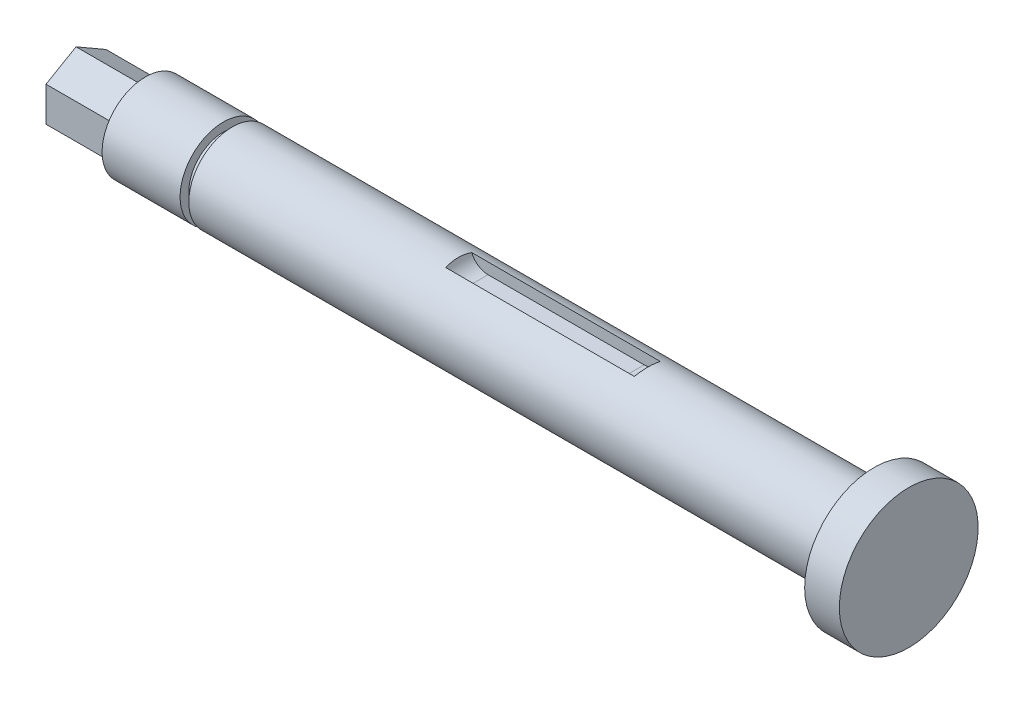
ISO-10303-21;
HEADER;
FILE_DESCRIPTION(('STEP AP214'),'2;1');
FILE_NAME('part.step','',(''),(''),'','','');
FILE_SCHEMA(('AUTOMOTIVE_DESIGN { 1 0 10303 214 1 1 1 1 }'));
ENDSEC;
DATA;
#1=APPLICATION_CONTEXT('core data for automotive mechanical design processes');
#2=APPLICATION_PROTOCOL_DEFINITION('international standard','automotive_design',2000,#1);
#3=PRODUCT_CONTEXT('',#1,'mechanical');
#4=PRODUCT('Part','Part','',(#3));
#5=PRODUCT_RELATED_PRODUCT_CATEGORY('part','',(#4));
#6=PRODUCT_DEFINITION_FORMATION('','',#4);
#7=PRODUCT_DEFINITION_CONTEXT('part definition',#1,'design');
#8=PRODUCT_DEFINITION('design','',#6,#7);
#9=PRODUCT_DEFINITION_SHAPE('','',#8);
#10=(LENGTH_UNIT() NAMED_UNIT(*) SI_UNIT(.MILLI.,.METRE.));
#11=(NAMED_UNIT(*) PLANE_ANGLE_UNIT() SI_UNIT($,.RADIAN.));
#12=(NAMED_UNIT(*) SI_UNIT($,.STERADIAN.) SOLID_ANGLE_UNIT());
#13=UNCERTAINTY_MEASURE_WITH_UNIT(LENGTH_MEASURE(1.E-05),#10,'distance_accuracy_value','');
#14=(GEOMETRIC_REPRESENTATION_CONTEXT(3) GLOBAL_UNCERTAINTY_ASSIGNED_CONTEXT((#13)) GLOBAL_UNIT_ASSIGNED_CONTEXT((#10,
#11,#12)) REPRESENTATION_CONTEXT('',''));
#15=CARTESIAN_POINT('',(0.,0.,0.));
#16=DIRECTION('',(0.,0.,1.));
#17=DIRECTION('',(1.,0.,0.));
#18=AXIS2_PLACEMENT_3D('',#15,#16,#17);
#19=CARTESIAN_POINT('',(12.7,6.35,0.));
#20=DIRECTION('',(1.,0.,0.));
#21=DIRECTION('',(0.,0.,-1.));
#22=AXIS2_PLACEMENT_3D('',#19,#20,#21);
#23=PLANE('',#22);
#24=DIRECTION('',(0.,-1.,0.));
#25=VECTOR('',#24,1.);
#26=CARTESIAN_POINT('',(12.7,3.17499999999999,-5.49926131403119));
#27=LINE('',#26,#25);
#28=CARTESIAN_POINT('',(12.7,3.17499999999998,-5.4992613140312));
#29=VERTEX_POINT('',#28);
#30=CARTESIAN_POINT('',(12.7,-3.17500000000002,-5.49926131403117));
#31=VERTEX_POINT('',#30);
#32=EDGE_CURVE('E166',#29,#31,#27,.T.);
#33=ORIENTED_EDGE('',*,*,#32,.F.);
#34=DIRECTION('',(0.,-0.499999999999996,-0.866025403784441));
#35=VECTOR('',#34,1.);
#36=CARTESIAN_POINT('',(12.7,6.34999999999993,0.));
#37=LINE('',#36,#35);
#38=CARTESIAN_POINT('',(12.7,6.34999999999993,0.));
#39=VERTEX_POINT('',#38);
#40=EDGE_CURVE('E97',#39,#29,#37,.T.);
#41=ORIENTED_EDGE('',*,*,#40,.F.);
#42=DIRECTION('',(0.,0.499999999999995,-0.866025403784442));
#43=VECTOR('',#42,1.);
#44=CARTESIAN_POINT('',(12.7,3.175,5.49926131403111));
#45=LINE('',#44,#43);
#46=CARTESIAN_POINT('',(12.7,3.175,5.49926131403111));
#47=VERTEX_POINT('',#46);
#48=EDGE_CURVE('E163',#47,#39,#45,.T.);
#49=ORIENTED_EDGE('',*,*,#48,.F.);
#50=DIRECTION('',(0.,1.,0.));
#51=VECTOR('',#50,1.);
#52=CARTESIAN_POINT('',(12.7,-3.17499999999995,5.49926131403121));
#53=LINE('',#52,#51);
#54=CARTESIAN_POINT('',(12.7,-3.17499999999995,5.49926131403121));
#55=VERTEX_POINT('',#54);
#56=EDGE_CURVE('E173',#55,#47,#53,.T.);
#57=ORIENTED_EDGE('',*,*,#56,.F.);
#58=DIRECTION('',(0.,0.500000000000007,0.866025403784435));
#59=VECTOR('',#58,1.);
#60=CARTESIAN_POINT('',(12.7,-6.35,0.));
#61=LINE('',#60,#59);
#62=CARTESIAN_POINT('',(12.7,-6.35,0.));
#63=VERTEX_POINT('',#62);
#64=EDGE_CURVE('E182',#63,#55,#61,.T.);
#65=ORIENTED_EDGE('',*,*,#64,.F.);
#66=DIRECTION('',(0.,-0.499999999999995,0.866025403784442));
#67=VECTOR('',#66,1.);
#68=CARTESIAN_POINT('',(12.7,-3.17500000000002,-5.49926131403117));
#69=LINE('',#68,#67);
#70=EDGE_CURVE('E187',#31,#63,#69,.T.);
#71=ORIENTED_EDGE('',*,*,#70,.F.);
#72=EDGE_LOOP('',(#33,#41,#49,#57,#65,#71));
#73=FACE_BOUND('',#72,.T.);
#74=CARTESIAN_POINT('',(12.7,0.,0.));
#75=DIRECTION('',(-1.,0.,0.));
#76=DIRECTION('',(0.,0.,1.));
#77=AXIS2_PLACEMENT_3D('',#74,#75,#76);
#78=CIRCLE('',#77,7.9375);
#79=CARTESIAN_POINT('',(12.7,0.,7.9375));
#80=VERTEX_POINT('',#79);
#81=EDGE_CURVE('E266',#80,#80,#78,.T.);
#82=ORIENTED_EDGE('',*,*,#81,.T.);
#83=EDGE_LOOP('',(#82));
#84=FACE_BOUND('',#83,.T.);
#85=ADVANCED_FACE('F74',(#73,#84),#23,.F.);
#86=CARTESIAN_POINT('',(-160.725070542685,0.,0.));
#87=DIRECTION('',(-1.,0.,0.));
#88=DIRECTION('',(0.,0.,1.));
#89=AXIS2_PLACEMENT_3D('',#86,#87,#88);
#90=CYLINDRICAL_SURFACE('',#89,7.9375);
#91=ORIENTED_EDGE('',*,*,#81,.F.);
#92=EDGE_LOOP('',(#91));
#93=FACE_BOUND('',#92,.T.);
#94=CARTESIAN_POINT('',(26.9748,0.,0.));
#95=DIRECTION('',(-1.,0.,0.));
#96=DIRECTION('',(0.,0.,1.));
#97=AXIS2_PLACEMENT_3D('',#94,#95,#96);
#98=CIRCLE('',#97,7.9375);
#99=CARTESIAN_POINT('',(26.9748,0.,7.9375));
#100=VERTEX_POINT('',#99);
#101=EDGE_CURVE('E262',#100,#100,#98,.T.);
#102=ORIENTED_EDGE('',*,*,#101,.T.);
#103=EDGE_LOOP('',(#102));
#104=FACE_BOUND('',#103,.T.);
#105=ADVANCED_FACE('F319',(#93,#104),#90,.T.);
#106=CARTESIAN_POINT('',(26.9748,7.9375,0.));
#107=DIRECTION('',(-1.,0.,0.));
#108=DIRECTION('',(0.,0.,1.));
#109=AXIS2_PLACEMENT_3D('',#106,#107,#108);
#110=PLANE('',#109);
#111=ORIENTED_EDGE('',*,*,#101,.F.);
#112=EDGE_LOOP('',(#111));
#113=FACE_BOUND('',#112,.T.);
#114=CARTESIAN_POINT('',(26.9748,0.,0.));
#115=DIRECTION('',(-1.,0.,0.));
#116=DIRECTION('',(0.,0.,1.));
#117=AXIS2_PLACEMENT_3D('',#114,#115,#116);
#118=CIRCLE('',#117,6.3373);
#119=CARTESIAN_POINT('',(26.9748,0.,6.3373));
#120=VERTEX_POINT('',#119);
#121=EDGE_CURVE('E258',#120,#120,#118,.T.);
#122=ORIENTED_EDGE('',*,*,#121,.T.);
#123=EDGE_LOOP('',(#122));
#124=FACE_BOUND('',#123,.T.);
#125=ADVANCED_FACE('F325',(#113,#124),#110,.F.);
#126=CARTESIAN_POINT('',(-160.725070542685,0.,0.));
#127=DIRECTION('',(-1.,0.,0.));
#128=DIRECTION('',(0.,0.,1.));
#129=AXIS2_PLACEMENT_3D('',#126,#127,#128);
#130=CYLINDRICAL_SURFACE('',#129,6.3373);
#131=ORIENTED_EDGE('',*,*,#121,.F.);
#132=EDGE_LOOP('',(#131));
#133=FACE_BOUND('',#132,.T.);
#134=CARTESIAN_POINT('',(28.575,0.,0.));
#135=DIRECTION('',(-1.,0.,0.));
#136=DIRECTION('',(0.,0.,1.));
#137=AXIS2_PLACEMENT_3D('',#134,#135,#136);
#138=CIRCLE('',#137,6.3373);
#139=CARTESIAN_POINT('',(28.575,0.,6.3373));
#140=VERTEX_POINT('',#139);
#141=EDGE_CURVE('E254',#140,#140,#138,.T.);
#142=ORIENTED_EDGE('',*,*,#141,.T.);
#143=EDGE_LOOP('',(#142));
#144=FACE_BOUND('',#143,.T.);
#145=ADVANCED_FACE('F331',(#133,#144),#130,.T.);
#146=CARTESIAN_POINT('',(28.575,6.3373,0.));
#147=DIRECTION('',(1.,0.,0.));
#148=DIRECTION('',(0.,0.,-1.));
#149=AXIS2_PLACEMENT_3D('',#146,#147,#148);
#150=PLANE('',#149);
#151=ORIENTED_EDGE('',*,*,#141,.F.);
#152=EDGE_LOOP('',(#151));
#153=FACE_BOUND('',#152,.T.);
#154=CARTESIAN_POINT('',(28.575,0.,0.));
#155=DIRECTION('',(-1.,0.,0.));
#156=DIRECTION('',(0.,0.,1.));
#157=AXIS2_PLACEMENT_3D('',#154,#155,#156);
#158=CIRCLE('',#157,7.9375);
#159=CARTESIAN_POINT('',(28.575,0.,7.9375));
#160=VERTEX_POINT('',#159);
#161=EDGE_CURVE('E250',#160,#160,#158,.T.);
#162=ORIENTED_EDGE('',*,*,#161,.T.);
#163=EDGE_LOOP('',(#162));
#164=FACE_BOUND('',#163,.T.);
#165=ADVANCED_FACE('F314',(#153,#164),#150,.F.);
#166=CARTESIAN_POINT('',(-160.725070542685,0.,0.));
#167=DIRECTION('',(-1.,0.,0.));
#168=DIRECTION('',(0.,0.,1.));
#169=AXIS2_PLACEMENT_3D('',#166,#167,#168);
#170=CYLINDRICAL_SURFACE('',#169,7.9375);
#171=CARTESIAN_POINT('',(70.0667575318649,7.57189241124701,2.38125));
#172=CARTESIAN_POINT('',(70.0547077003657,7.60283748159561,2.2828611464457));
#173=CARTESIAN_POINT('',(70.0439278662388,7.63190103640766,2.18373394589652));
#174=CARTESIAN_POINT('',(70.0245768049551,7.68618284099055,1.98423094459988));
#175=CARTESIAN_POINT('',(70.0160053112933,7.71140155461096,1.88385529605055));
#176=CARTESIAN_POINT('',(70.0007406043774,7.75790730479949,1.68210998868868));
#177=CARTESIAN_POINT('',(69.9940464557926,7.77919629741932,1.58074085099975));
#178=CARTESIAN_POINT('',(69.9822696330404,7.81780480710201,1.37716069329768));
#179=CARTESIAN_POINT('',(69.9771870047471,7.83512421116123,1.2749496494035));
#180=CARTESIAN_POINT('',(69.9642408857745,7.88028783199856,0.972518602068048));
#181=CARTESIAN_POINT('',(69.9583162704699,7.90252061667355,0.771346365920788));
#182=CARTESIAN_POINT('',(69.9506794210857,7.93155475211319,0.367812192026652));
#183=CARTESIAN_POINT('',(69.9489677390323,7.93835408060337,0.165450101853557));
#184=CARTESIAN_POINT('',(69.949442775625,7.93650243379859,-0.233209512953227));
#185=CARTESIAN_POINT('',(69.9515157047947,7.92830242011707,-0.42950940820735));
#186=CARTESIAN_POINT('',(69.9596947493576,7.89737846148739,-0.820870390107997));
#187=CARTESIAN_POINT('',(69.9658001587861,7.87465705881517,-1.01593168756148));
#188=CARTESIAN_POINT('',(69.9788488663797,7.82945029286182,-1.30909544958882));
#189=CARTESIAN_POINT('',(69.9839338818715,7.81224594563471,-1.40812396106605));
#190=CARTESIAN_POINT('',(69.9956400417717,7.77410905883621,-1.60537279101093));
#191=CARTESIAN_POINT('',(70.0022611439788,7.7531766216913,-1.70359313160493));
#192=CARTESIAN_POINT('',(70.0172851652548,7.70762154640837,-1.89909267282386));
#193=CARTESIAN_POINT('',(70.0256890236687,7.68299696487047,-1.99637134891407));
#194=CARTESIAN_POINT('',(70.0445825527755,7.63013554179114,-2.18974831448237));
#195=CARTESIAN_POINT('',(70.0550724600671,7.60189829063224,-2.28584646875236));
#196=CARTESIAN_POINT('',(70.0667575318649,7.57189241124701,-2.38125));
#197=B_SPLINE_CURVE_WITH_KNOTS('',3,(#171,#172,#173,#174,#175,#176,#177,#178,#179,#180,#181,
#182,#183,#184,#185,#186,#187,#188,#189,#190,#191,#192,#193,#194,#195,#196),.UNSPECIFIED.,.F.,
.F.,(4,2,2,2,2,2,2,2,2,2,2,2,4),(0.,0.311486004627483,0.622934401155592,0.934227351103223,
1.24552916163332,1.85227877141673,2.45910788014199,3.0479913842207,3.63677182003085,
3.93862384263224,4.24046757335365,4.54247074416797,4.84450818758329),.UNSPECIFIED.);
#198=CARTESIAN_POINT('',(70.0667575318649,7.57189241124701,2.38125));
#199=VERTEX_POINT('',#198);
#200=CARTESIAN_POINT('',(70.0667575318649,7.57189241124701,-2.38125));
#201=VERTEX_POINT('',#200);
#202=EDGE_CURVE('E273',#199,#201,#197,.T.);
#203=ORIENTED_EDGE('',*,*,#202,.T.);
#204=DIRECTION('',(-1.,0.,0.));
#205=VECTOR('',#204,1.);
#206=CARTESIAN_POINT('',(-160.725070542685,7.57189241124701,-2.38125));
#207=LINE('',#206,#205);
#208=CARTESIAN_POINT('',(104.558242468135,7.57189241124701,-2.38125));
#209=VERTEX_POINT('',#208);
#210=EDGE_CURVE('E13',#201,#209,#207,.F.);
#211=ORIENTED_EDGE('',*,*,#210,.T.);
#212=CARTESIAN_POINT('',(104.558242468135,7.57189241124701,-2.38125));
#213=CARTESIAN_POINT('',(104.570292299634,7.60283748159561,-2.28286114644571));
#214=CARTESIAN_POINT('',(104.581072133761,7.63190103640766,-2.18373394589652));
#215=CARTESIAN_POINT('',(104.600423195045,7.68618284099055,-1.98423094459988));
#216=CARTESIAN_POINT('',(104.608994688707,7.71140155461096,-1.88385529605055));
#217=CARTESIAN_POINT('',(104.624259395623,7.75790730479949,-1.68210998868868));
#218=CARTESIAN_POINT('',(104.630953544207,7.77919629741932,-1.58074085099974));
#219=CARTESIAN_POINT('',(104.64273036696,7.81780480710201,-1.37716069329768));
#220=CARTESIAN_POINT('',(104.647812995253,7.83512421116124,-1.2749496494035));
#221=CARTESIAN_POINT('',(104.660759114225,7.88028783199856,-0.972518602068044));
#222=CARTESIAN_POINT('',(104.66668372953,7.90252061667355,-0.771346365920781));
#223=CARTESIAN_POINT('',(104.674320578914,7.93155475211319,-0.367812192026643));
#224=CARTESIAN_POINT('',(104.676032260968,7.93835408060337,-0.165450101853547));
#225=CARTESIAN_POINT('',(104.675557224375,7.93650243379859,0.233209512953237));
#226=CARTESIAN_POINT('',(104.673484295205,7.92830242011707,0.42950940820736));
#227=CARTESIAN_POINT('',(104.665305250642,7.89737846148739,0.820870390108005));
#228=CARTESIAN_POINT('',(104.659199841214,7.87465705881517,1.01593168756148));
#229=CARTESIAN_POINT('',(104.64615113362,7.82945029286181,1.30909544958883));
#230=CARTESIAN_POINT('',(104.641066118128,7.81224594563471,1.40812396106605));
#231=CARTESIAN_POINT('',(104.629359958228,7.77410905883621,1.60537279101093));
#232=CARTESIAN_POINT('',(104.622738856021,7.7531766216913,1.70359313160493));
#233=CARTESIAN_POINT('',(104.607714834745,7.70762154640837,1.89909267282386));
#234=CARTESIAN_POINT('',(104.599310976331,7.68299696487047,1.99637134891407));
#235=CARTESIAN_POINT('',(104.580417447224,7.63013554179114,2.18974831448237));
#236=CARTESIAN_POINT('',(104.569927539933,7.60189829063224,2.28584646875236));
#237=CARTESIAN_POINT('',(104.558242468135,7.57189241124701,2.38125));
#238=B_SPLINE_CURVE_WITH_KNOTS('',3,(#212,#213,#214,#215,#216,#217,#218,#219,#220,#221,#222,
#223,#224,#225,#226,#227,#228,#229,#230,#231,#232,#233,#234,#235,#236,#237),.UNSPECIFIED.,.F.,
.F.,(4,2,2,2,2,2,2,2,2,2,2,2,4),(0.,0.311486004627483,0.622934401155594,0.934227351103227,
1.24552916163332,1.85227877141674,2.459107880142,3.04799138422071,3.63677182003086,
3.93862384263224,4.24046757335365,4.54247074416798,4.8445081875833),.UNSPECIFIED.);
#239=CARTESIAN_POINT('',(104.558242468135,7.57189241124701,2.38125));
#240=VERTEX_POINT('',#239);
#241=EDGE_CURVE('E83',#209,#240,#238,.T.);
#242=ORIENTED_EDGE('',*,*,#241,.T.);
#243=DIRECTION('',(-1.,0.,0.));
#244=VECTOR('',#243,1.);
#245=CARTESIAN_POINT('',(-160.725070542685,7.57189241124701,2.38125));
#246=LINE('',#245,#244);
#247=EDGE_CURVE('E270',#199,#240,#246,.F.);
#248=ORIENTED_EDGE('',*,*,#247,.F.);
#249=EDGE_LOOP('',(#203,#211,#242,#248));
#250=FACE_BOUND('',#249,.T.);
#251=ORIENTED_EDGE('',*,*,#161,.F.);
#252=EDGE_LOOP('',(#251));
#253=FACE_BOUND('',#252,.T.);
#254=CARTESIAN_POINT('',(146.05,0.,0.));
#255=DIRECTION('',(-1.,0.,0.));
#256=DIRECTION('',(0.,0.,1.));
#257=AXIS2_PLACEMENT_3D('',#254,#255,#256);
#258=CIRCLE('',#257,7.9375);
#259=CARTESIAN_POINT('',(146.05,0.,7.9375));
#260=VERTEX_POINT('',#259);
#261=EDGE_CURVE('E246',#260,#260,#258,.T.);
#262=ORIENTED_EDGE('',*,*,#261,.T.);
#263=EDGE_LOOP('',(#262));
#264=FACE_BOUND('',#263,.T.);
#265=ADVANCED_FACE('F287',(#250,#253,#264),#170,.T.);
#266=CARTESIAN_POINT('',(146.05,7.9375,0.));
#267=DIRECTION('',(1.,0.,0.));
#268=DIRECTION('',(0.,0.,-1.));
#269=AXIS2_PLACEMENT_3D('',#266,#267,#268);
#270=PLANE('',#269);
#271=ORIENTED_EDGE('',*,*,#261,.F.);
#272=EDGE_LOOP('',(#271));
#273=FACE_BOUND('',#272,.T.);
#274=CARTESIAN_POINT('',(146.05,0.,0.));
#275=DIRECTION('',(-1.,0.,0.));
#276=DIRECTION('',(0.,0.,1.));
#277=AXIS2_PLACEMENT_3D('',#274,#275,#276);
#278=CIRCLE('',#277,12.7);
#279=CARTESIAN_POINT('',(146.05,0.,12.7));
#280=VERTEX_POINT('',#279);
#281=EDGE_CURVE('E242',#280,#280,#278,.T.);
#282=ORIENTED_EDGE('',*,*,#281,.T.);
#283=EDGE_LOOP('',(#282));
#284=FACE_BOUND('',#283,.T.);
#285=ADVANCED_FACE('F306',(#273,#284),#270,.F.);
#286=CARTESIAN_POINT('',(-160.725070542685,0.,0.));
#287=DIRECTION('',(-1.,0.,0.));
#288=DIRECTION('',(0.,0.,1.));
#289=AXIS2_PLACEMENT_3D('',#286,#287,#288);
#290=CYLINDRICAL_SURFACE('',#289,12.7);
#291=ORIENTED_EDGE('',*,*,#281,.F.);
#292=EDGE_LOOP('',(#291));
#293=FACE_BOUND('',#292,.T.);
#294=CARTESIAN_POINT('',(152.4,0.,0.));
#295=DIRECTION('',(-1.,0.,0.));
#296=DIRECTION('',(0.,0.,1.));
#297=AXIS2_PLACEMENT_3D('',#294,#295,#296);
#298=CIRCLE('',#297,12.6999999999999);
#299=CARTESIAN_POINT('',(152.4,0.,12.6999999999999));
#300=VERTEX_POINT('',#299);
#301=EDGE_CURVE('E235',#300,#300,#298,.T.);
#302=ORIENTED_EDGE('',*,*,#301,.T.);
#303=EDGE_LOOP('',(#302));
#304=FACE_BOUND('',#303,.T.);
#305=ADVANCED_FACE('F303',(#293,#304),#290,.T.);
#306=CARTESIAN_POINT('',(152.4,12.6999999999999,0.));
#307=DIRECTION('',(-1.,0.,0.));
#308=DIRECTION('',(0.,0.,1.));
#309=AXIS2_PLACEMENT_3D('',#306,#307,#308);
#310=PLANE('',#309);
#311=ORIENTED_EDGE('',*,*,#301,.F.);
#312=EDGE_LOOP('',(#311));
#313=FACE_BOUND('',#312,.T.);
#314=ADVANCED_FACE('F300',(#313),#310,.F.);
#315=CARTESIAN_POINT('',(101.6,8.7249,-2.38125));
#316=DIRECTION('',(0.,0.,1.));
#317=DIRECTION('',(1.,0.,0.));
#318=AXIS2_PLACEMENT_3D('',#315,#316,#317);
#319=CYLINDRICAL_SURFACE('',#318,3.175);
#320=CARTESIAN_POINT('',(101.6,8.7249,-2.38125));
#321=DIRECTION('',(0.,0.,1.));
#322=DIRECTION('',(-1.,0.,0.));
#323=AXIS2_PLACEMENT_3D('',#320,#321,#322);
#324=CIRCLE('',#323,3.175);
#325=CARTESIAN_POINT('',(101.6,5.5499,-2.38125));
#326=VERTEX_POINT('',#325);
#327=EDGE_CURVE('E218',#326,#209,#324,.T.);
#328=ORIENTED_EDGE('',*,*,#327,.F.);
#329=DIRECTION('',(0.,0.,1.));
#330=VECTOR('',#329,1.);
#331=CARTESIAN_POINT('',(101.6,5.5499,-2.38125));
#332=LINE('',#331,#330);
#333=CARTESIAN_POINT('',(101.6,5.5499,2.38125));
#334=VERTEX_POINT('',#333);
#335=EDGE_CURVE('E232',#326,#334,#332,.T.);
#336=ORIENTED_EDGE('',*,*,#335,.T.);
#337=CARTESIAN_POINT('',(101.6,8.7249,2.38125));
#338=DIRECTION('',(0.,0.,1.));
#339=DIRECTION('',(-1.,0.,0.));
#340=AXIS2_PLACEMENT_3D('',#337,#338,#339);
#341=CIRCLE('',#340,3.175);
#342=EDGE_CURVE('E214',#334,#240,#341,.T.);
#343=ORIENTED_EDGE('',*,*,#342,.T.);
#344=ORIENTED_EDGE('',*,*,#241,.F.);
#345=EDGE_LOOP('',(#328,#336,#343,#344));
#346=FACE_BOUND('',#345,.T.);
#347=ADVANCED_FACE('F297',(#346),#319,.F.);
#348=CARTESIAN_POINT('',(73.025,8.72490000000002,-2.38125));
#349=DIRECTION('',(0.,0.,1.));
#350=DIRECTION('',(1.,0.,0.));
#351=AXIS2_PLACEMENT_3D('',#348,#349,#350);
#352=CYLINDRICAL_SURFACE('',#351,3.175);
#353=CARTESIAN_POINT('',(73.025,8.72490000000002,2.38125));
#354=DIRECTION('',(0.,0.,1.));
#355=DIRECTION('',(-1.,0.,0.));
#356=AXIS2_PLACEMENT_3D('',#353,#354,#355);
#357=CIRCLE('',#356,3.175);
#358=CARTESIAN_POINT('',(73.025,5.54990000000002,2.38125));
#359=VERTEX_POINT('',#358);
#360=EDGE_CURVE('E186',#199,#359,#357,.T.);
#361=ORIENTED_EDGE('',*,*,#360,.T.);
#362=DIRECTION('',(0.,0.,1.));
#363=VECTOR('',#362,1.);
#364=CARTESIAN_POINT('',(73.025,5.54990000000002,-2.38125));
#365=LINE('',#364,#363);
#366=CARTESIAN_POINT('',(73.025,5.54990000000002,-2.38125));
#367=VERTEX_POINT('',#366);
#368=EDGE_CURVE('E222',#367,#359,#365,.T.);
#369=ORIENTED_EDGE('',*,*,#368,.F.);
#370=CARTESIAN_POINT('',(73.025,8.72490000000002,-2.38125));
#371=DIRECTION('',(0.,0.,1.));
#372=DIRECTION('',(-1.,0.,0.));
#373=AXIS2_PLACEMENT_3D('',#370,#371,#372);
#374=CIRCLE('',#373,3.175);
#375=EDGE_CURVE('E210',#201,#367,#374,.T.);
#376=ORIENTED_EDGE('',*,*,#375,.F.);
#377=ORIENTED_EDGE('',*,*,#202,.F.);
#378=EDGE_LOOP('',(#361,#369,#376,#377));
#379=FACE_BOUND('',#378,.T.);
#380=ADVANCED_FACE('F291',(#379),#352,.F.);
#381=CARTESIAN_POINT('',(101.6,8.7249,-2.38125));
#382=DIRECTION('',(0.,0.,-1.));
#383=DIRECTION('',(-1.,0.,0.));
#384=AXIS2_PLACEMENT_3D('',#381,#382,#383);
#385=PLANE('',#384);
#386=ORIENTED_EDGE('',*,*,#375,.T.);
#387=DIRECTION('',(1.,0.,0.));
#388=VECTOR('',#387,1.);
#389=CARTESIAN_POINT('',(101.6,5.5499,-2.38125));
#390=LINE('',#389,#388);
#391=EDGE_CURVE('E213',#367,#326,#390,.T.);
#392=ORIENTED_EDGE('',*,*,#391,.T.);
#393=ORIENTED_EDGE('',*,*,#327,.T.);
#394=ORIENTED_EDGE('',*,*,#210,.F.);
#395=EDGE_LOOP('',(#386,#392,#393,#394));
#396=FACE_BOUND('',#395,.T.);
#397=ADVANCED_FACE('F296',(#396),#385,.F.);
#398=CARTESIAN_POINT('',(101.6,8.7249,2.38125));
#399=DIRECTION('',(0.,0.,-1.));
#400=DIRECTION('',(-1.,0.,0.));
#401=AXIS2_PLACEMENT_3D('',#398,#399,#400);
#402=PLANE('',#401);
#403=ORIENTED_EDGE('',*,*,#247,.T.);
#404=ORIENTED_EDGE('',*,*,#342,.F.);
#405=DIRECTION('',(1.,0.,0.));
#406=VECTOR('',#405,1.);
#407=CARTESIAN_POINT('',(101.6,5.5499,2.38125));
#408=LINE('',#407,#406);
#409=EDGE_CURVE('E225',#359,#334,#408,.T.);
#410=ORIENTED_EDGE('',*,*,#409,.F.);
#411=ORIENTED_EDGE('',*,*,#360,.F.);
#412=EDGE_LOOP('',(#403,#404,#410,#411));
#413=FACE_BOUND('',#412,.T.);
#414=ADVANCED_FACE('F468',(#413),#402,.T.);
#415=CARTESIAN_POINT('',(101.6,5.5499,-2.38125));
#416=DIRECTION('',(0.,-1.,0.));
#417=DIRECTION('',(1.,0.,0.));
#418=AXIS2_PLACEMENT_3D('',#415,#416,#417);
#419=PLANE('',#418);
#420=ORIENTED_EDGE('',*,*,#409,.T.);
#421=ORIENTED_EDGE('',*,*,#335,.F.);
#422=ORIENTED_EDGE('',*,*,#391,.F.);
#423=ORIENTED_EDGE('',*,*,#368,.T.);
#424=EDGE_LOOP('',(#420,#421,#422,#423));
#425=FACE_BOUND('',#424,.T.);
#426=ADVANCED_FACE('F299',(#425),#419,.F.);
#427=CARTESIAN_POINT('',(48.9802347291194,3.175,5.49926131403111));
#428=DIRECTION('',(0.,0.866025403784441,0.499999999999995));
#429=DIRECTION('',(0.,-0.499999999999995,0.866025403784442));
#430=AXIS2_PLACEMENT_3D('',#427,#428,#429);
#431=PLANE('',#430);
#432=ORIENTED_EDGE('',*,*,#48,.T.);
#433=DIRECTION('',(-1.,0.,0.));
#434=VECTOR('',#433,1.);
#435=CARTESIAN_POINT('',(48.9802347291194,6.34999999999993,0.));
#436=LINE('',#435,#434);
#437=CARTESIAN_POINT('',(0.,6.34999999999993,0.));
#438=VERTEX_POINT('',#437);
#439=EDGE_CURVE('E151',#39,#438,#436,.T.);
#440=ORIENTED_EDGE('',*,*,#439,.T.);
#441=DIRECTION('',(0.,0.499999999999995,-0.866025403784441));
#442=VECTOR('',#441,1.);
#443=CARTESIAN_POINT('',(0.,3.175,5.49926131403111));
#444=LINE('',#443,#442);
#445=CARTESIAN_POINT('',(0.,3.175,5.49926131403111));
#446=VERTEX_POINT('',#445);
#447=EDGE_CURVE('E179',#446,#438,#444,.T.);
#448=ORIENTED_EDGE('',*,*,#447,.F.);
#449=DIRECTION('',(-1.,0.,0.));
#450=VECTOR('',#449,1.);
#451=CARTESIAN_POINT('',(48.9802347291194,3.175,5.49926131403111));
#452=LINE('',#451,#450);
#453=EDGE_CURVE('E170',#47,#446,#452,.T.);
#454=ORIENTED_EDGE('',*,*,#453,.F.);
#455=EDGE_LOOP('',(#432,#440,#448,#454));
#456=FACE_BOUND('',#455,.T.);
#457=ADVANCED_FACE('F169',(#456),#431,.T.);
#458=CARTESIAN_POINT('',(48.9802347291194,-3.17499999999995,5.49926131403121));
#459=DIRECTION('',(0.,0.,1.));
#460=DIRECTION('',(0.,-1.,0.));
#461=AXIS2_PLACEMENT_3D('',#458,#459,#460);
#462=PLANE('',#461);
#463=ORIENTED_EDGE('',*,*,#56,.T.);
#464=ORIENTED_EDGE('',*,*,#453,.T.);
#465=DIRECTION('',(0.,1.,0.));
#466=VECTOR('',#465,1.);
#467=CARTESIAN_POINT('',(0.,-3.17499999999995,5.49926131403121));
#468=LINE('',#467,#466);
#469=CARTESIAN_POINT('',(0.,-3.17499999999995,5.49926131403121));
#470=VERTEX_POINT('',#469);
#471=EDGE_CURVE('E198',#470,#446,#468,.T.);
#472=ORIENTED_EDGE('',*,*,#471,.F.);
#473=DIRECTION('',(-1.,0.,0.));
#474=VECTOR('',#473,1.);
#475=CARTESIAN_POINT('',(48.9802347291194,-3.17499999999995,5.49926131403121));
#476=LINE('',#475,#474);
#477=EDGE_CURVE('E195',#55,#470,#476,.T.);
#478=ORIENTED_EDGE('',*,*,#477,.F.);
#479=EDGE_LOOP('',(#463,#464,#472,#478));
#480=FACE_BOUND('',#479,.T.);
#481=ADVANCED_FACE('F382',(#480),#462,.T.);
#482=CARTESIAN_POINT('',(48.9802347291194,-6.35,0.));
#483=DIRECTION('',(0.,-0.866025403784435,0.500000000000007));
#484=DIRECTION('',(0.,-0.500000000000007,-0.866025403784435));
#485=AXIS2_PLACEMENT_3D('',#482,#483,#484);
#486=PLANE('',#485);
#487=ORIENTED_EDGE('',*,*,#64,.T.);
#488=ORIENTED_EDGE('',*,*,#477,.T.);
#489=DIRECTION('',(0.,0.500000000000007,0.866025403784435));
#490=VECTOR('',#489,1.);
#491=CARTESIAN_POINT('',(0.,-6.35,0.));
#492=LINE('',#491,#490);
#493=CARTESIAN_POINT('',(0.,-6.35,0.));
#494=VERTEX_POINT('',#493);
#495=EDGE_CURVE('E202',#494,#470,#492,.T.);
#496=ORIENTED_EDGE('',*,*,#495,.F.);
#497=DIRECTION('',(-1.,0.,0.));
#498=VECTOR('',#497,1.);
#499=CARTESIAN_POINT('',(48.9802347291194,-6.35,0.));
#500=LINE('',#499,#498);
#501=EDGE_CURVE('E199',#63,#494,#500,.T.);
#502=ORIENTED_EDGE('',*,*,#501,.F.);
#503=EDGE_LOOP('',(#487,#488,#496,#502));
#504=FACE_BOUND('',#503,.T.);
#505=ADVANCED_FACE('F391',(#504),#486,.T.);
#506=CARTESIAN_POINT('',(48.9802347291194,-3.17500000000002,-5.49926131403117));
#507=DIRECTION('',(0.,-0.866025403784441,-0.499999999999995));
#508=DIRECTION('',(0.,0.499999999999995,-0.866025403784442));
#509=AXIS2_PLACEMENT_3D('',#506,#507,#508);
#510=PLANE('',#509);
#511=ORIENTED_EDGE('',*,*,#70,.T.);
#512=ORIENTED_EDGE('',*,*,#501,.T.);
#513=DIRECTION('',(0.,-0.499999999999995,0.866025403784441));
#514=VECTOR('',#513,1.);
#515=CARTESIAN_POINT('',(0.,-3.17500000000002,-5.49926131403117));
#516=LINE('',#515,#514);
#517=CARTESIAN_POINT('',(0.,-3.17500000000002,-5.49926131403117));
#518=VERTEX_POINT('',#517);
#519=EDGE_CURVE('E206',#518,#494,#516,.T.);
#520=ORIENTED_EDGE('',*,*,#519,.F.);
#521=DIRECTION('',(-1.,0.,0.));
#522=VECTOR('',#521,1.);
#523=CARTESIAN_POINT('',(48.9802347291194,-3.17500000000002,-5.49926131403117));
#524=LINE('',#523,#522);
#525=EDGE_CURVE('E203',#31,#518,#524,.T.);
#526=ORIENTED_EDGE('',*,*,#525,.F.);
#527=EDGE_LOOP('',(#511,#512,#520,#526));
#528=FACE_BOUND('',#527,.T.);
#529=ADVANCED_FACE('F401',(#528),#510,.T.);
#530=CARTESIAN_POINT('',(48.9802347291194,3.17499999999999,-5.49926131403119));
#531=DIRECTION('',(0.,0.,-1.));
#532=DIRECTION('',(0.,1.,0.));
#533=AXIS2_PLACEMENT_3D('',#530,#531,#532);
#534=PLANE('',#533);
#535=ORIENTED_EDGE('',*,*,#32,.T.);
#536=ORIENTED_EDGE('',*,*,#525,.T.);
#537=DIRECTION('',(0.,-1.,0.));
#538=VECTOR('',#537,1.);
#539=CARTESIAN_POINT('',(0.,3.17499999999999,-5.49926131403119));
#540=LINE('',#539,#538);
#541=CARTESIAN_POINT('',(0.,3.17499999999999,-5.49926131403119));
#542=VERTEX_POINT('',#541);
#543=EDGE_CURVE('E90',#542,#518,#540,.T.);
#544=ORIENTED_EDGE('',*,*,#543,.F.);
#545=DIRECTION('',(-1.,0.,0.));
#546=VECTOR('',#545,1.);
#547=CARTESIAN_POINT('',(48.9802347291194,3.17499999999999,-5.49926131403119));
#548=LINE('',#547,#546);
#549=EDGE_CURVE('E207',#29,#542,#548,.T.);
#550=ORIENTED_EDGE('',*,*,#549,.F.);
#551=EDGE_LOOP('',(#535,#536,#544,#550));
#552=FACE_BOUND('',#551,.T.);
#553=ADVANCED_FACE('F411',(#552),#534,.T.);
#554=CARTESIAN_POINT('',(48.9802347291194,6.34999999999993,0.));
#555=DIRECTION('',(0.,0.866025403784441,-0.499999999999996));
#556=DIRECTION('',(0.,0.499999999999996,0.866025403784441));
#557=AXIS2_PLACEMENT_3D('',#554,#555,#556);
#558=PLANE('',#557);
#559=ORIENTED_EDGE('',*,*,#40,.T.);
#560=ORIENTED_EDGE('',*,*,#549,.T.);
#561=DIRECTION('',(0.,-0.499999999999996,-0.866025403784441));
#562=VECTOR('',#561,1.);
#563=CARTESIAN_POINT('',(0.,6.34999999999993,0.));
#564=LINE('',#563,#562);
#565=EDGE_CURVE('E154',#438,#542,#564,.T.);
#566=ORIENTED_EDGE('',*,*,#565,.F.);
#567=ORIENTED_EDGE('',*,*,#439,.F.);
#568=EDGE_LOOP('',(#559,#560,#566,#567));
#569=FACE_BOUND('',#568,.T.);
#570=ADVANCED_FACE('F152',(#569),#558,.T.);
#571=CARTESIAN_POINT('',(0.,0.,0.));
#572=DIRECTION('',(1.,0.,0.));
#573=DIRECTION('',(0.,0.,-1.));
#574=AXIS2_PLACEMENT_3D('',#571,#572,#573);
#575=PLANE('',#574);
#576=ORIENTED_EDGE('',*,*,#447,.T.);
#577=ORIENTED_EDGE('',*,*,#565,.T.);
#578=ORIENTED_EDGE('',*,*,#543,.T.);
#579=ORIENTED_EDGE('',*,*,#519,.T.);
#580=ORIENTED_EDGE('',*,*,#495,.T.);
#581=ORIENTED_EDGE('',*,*,#471,.T.);
#582=EDGE_LOOP('',(#576,#577,#578,#579,#580,#581));
#583=FACE_BOUND('',#582,.T.);
#584=ADVANCED_FACE('F76',(#583),#575,.F.);
#585=CLOSED_SHELL('',(#85,#105,#125,#145,#165,#265,#285,#305,#314,#347,#380,#397,#414,#426,#457,
#481,#505,#529,#553,#570,#584));
#586=MANIFOLD_SOLID_BREP('B2',#585);
#587=ADVANCED_BREP_SHAPE_REPRESENTATION('',(#18,#586),#14);
#588=SHAPE_DEFINITION_REPRESENTATION(#9,#587);
ENDSEC;
END-ISO-10303-21;
